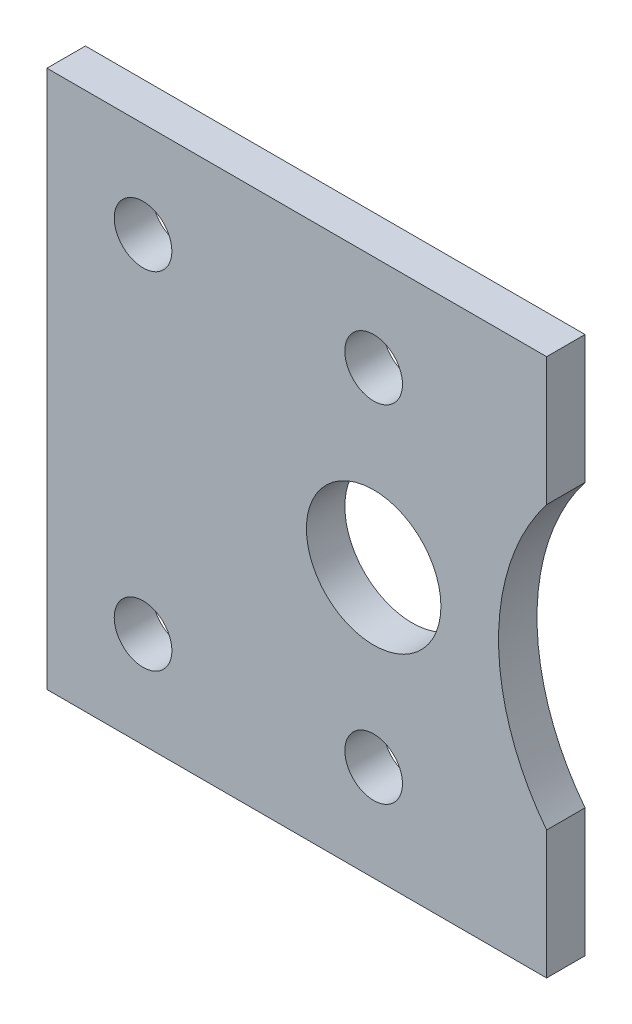
ISO-10303-21;
HEADER;
FILE_DESCRIPTION(('STEP AP214'),'2;1');
FILE_NAME('part.step','',(''),(''),'','','');
FILE_SCHEMA(('AUTOMOTIVE_DESIGN { 1 0 10303 214 1 1 1 1 }'));
ENDSEC;
DATA;
#1=APPLICATION_CONTEXT('core data for automotive mechanical design processes');
#2=APPLICATION_PROTOCOL_DEFINITION('international standard','automotive_design',2000,#1);
#3=PRODUCT_CONTEXT('',#1,'mechanical');
#4=PRODUCT('Part','Part','',(#3));
#5=PRODUCT_RELATED_PRODUCT_CATEGORY('part','',(#4));
#6=PRODUCT_DEFINITION_FORMATION('','',#4);
#7=PRODUCT_DEFINITION_CONTEXT('part definition',#1,'design');
#8=PRODUCT_DEFINITION('design','',#6,#7);
#9=PRODUCT_DEFINITION_SHAPE('','',#8);
#10=(LENGTH_UNIT() NAMED_UNIT(*) SI_UNIT(.MILLI.,.METRE.));
#11=(NAMED_UNIT(*) PLANE_ANGLE_UNIT() SI_UNIT($,.RADIAN.));
#12=(NAMED_UNIT(*) SI_UNIT($,.STERADIAN.) SOLID_ANGLE_UNIT());
#13=UNCERTAINTY_MEASURE_WITH_UNIT(LENGTH_MEASURE(1.E-05),#10,'distance_accuracy_value','');
#14=(GEOMETRIC_REPRESENTATION_CONTEXT(3) GLOBAL_UNCERTAINTY_ASSIGNED_CONTEXT((#13)) GLOBAL_UNIT_ASSIGNED_CONTEXT((#10,
#11,#12)) REPRESENTATION_CONTEXT('',''));
#15=CARTESIAN_POINT('',(0.,0.,0.));
#16=DIRECTION('',(0.,0.,1.));
#17=DIRECTION('',(1.,0.,0.));
#18=AXIS2_PLACEMENT_3D('',#15,#16,#17);
#19=CARTESIAN_POINT('',(-17.,14.,-2.));
#20=DIRECTION('',(-1.,0.,0.));
#21=DIRECTION('',(0.,0.,1.));
#22=AXIS2_PLACEMENT_3D('',#19,#20,#21);
#23=PLANE('',#22);
#24=DIRECTION('',(0.,-1.,0.));
#25=VECTOR('',#24,1.);
#26=CARTESIAN_POINT('',(-17.,14.,0.));
#27=LINE('',#26,#25);
#28=CARTESIAN_POINT('',(-17.,14.,0.));
#29=VERTEX_POINT('',#28);
#30=CARTESIAN_POINT('',(-17.,-14.,0.));
#31=VERTEX_POINT('',#30);
#32=EDGE_CURVE('E125',#29,#31,#27,.T.);
#33=ORIENTED_EDGE('',*,*,#32,.F.);
#34=DIRECTION('',(0.,0.,1.));
#35=VECTOR('',#34,1.);
#36=CARTESIAN_POINT('',(-17.,14.,-2.));
#37=LINE('',#36,#35);
#38=CARTESIAN_POINT('',(-17.,14.,-2.));
#39=VERTEX_POINT('',#38);
#40=EDGE_CURVE('E11',#39,#29,#37,.T.);
#41=ORIENTED_EDGE('',*,*,#40,.F.);
#42=DIRECTION('',(0.,-1.,0.));
#43=VECTOR('',#42,1.);
#44=CARTESIAN_POINT('',(-17.,14.,-2.));
#45=LINE('',#44,#43);
#46=CARTESIAN_POINT('',(-17.,-14.,-2.));
#47=VERTEX_POINT('',#46);
#48=EDGE_CURVE('E137',#39,#47,#45,.T.);
#49=ORIENTED_EDGE('',*,*,#48,.T.);
#50=DIRECTION('',(0.,0.,1.));
#51=VECTOR('',#50,1.);
#52=CARTESIAN_POINT('',(-17.,-14.,-2.));
#53=LINE('',#52,#51);
#54=EDGE_CURVE('E45',#47,#31,#53,.T.);
#55=ORIENTED_EDGE('',*,*,#54,.T.);
#56=EDGE_LOOP('',(#33,#41,#49,#55));
#57=FACE_BOUND('',#56,.T.);
#58=ADVANCED_FACE('F39',(#57),#23,.T.);
#59=CARTESIAN_POINT('',(9.,14.,-2.));
#60=DIRECTION('',(0.,1.,0.));
#61=DIRECTION('',(-1.,0.,0.));
#62=AXIS2_PLACEMENT_3D('',#59,#60,#61);
#63=PLANE('',#62);
#64=DIRECTION('',(-1.,0.,0.));
#65=VECTOR('',#64,1.);
#66=CARTESIAN_POINT('',(9.,14.,0.));
#67=LINE('',#66,#65);
#68=CARTESIAN_POINT('',(9.,14.,0.));
#69=VERTEX_POINT('',#68);
#70=EDGE_CURVE('E140',#69,#29,#67,.T.);
#71=ORIENTED_EDGE('',*,*,#70,.F.);
#72=DIRECTION('',(0.,0.,1.));
#73=VECTOR('',#72,1.);
#74=CARTESIAN_POINT('',(9.,14.,-2.));
#75=LINE('',#74,#73);
#76=CARTESIAN_POINT('',(9.,14.,-2.));
#77=VERTEX_POINT('',#76);
#78=EDGE_CURVE('E48',#77,#69,#75,.T.);
#79=ORIENTED_EDGE('',*,*,#78,.F.);
#80=DIRECTION('',(-1.,0.,0.));
#81=VECTOR('',#80,1.);
#82=CARTESIAN_POINT('',(9.,14.,-2.));
#83=LINE('',#82,#81);
#84=EDGE_CURVE('E114',#77,#39,#83,.T.);
#85=ORIENTED_EDGE('',*,*,#84,.T.);
#86=ORIENTED_EDGE('',*,*,#40,.T.);
#87=EDGE_LOOP('',(#71,#79,#85,#86));
#88=FACE_BOUND('',#87,.T.);
#89=ADVANCED_FACE('F150',(#88),#63,.T.);
#90=CARTESIAN_POINT('',(9.,7.33143914930759,-2.));
#91=DIRECTION('',(1.,0.,0.));
#92=DIRECTION('',(0.,0.,-1.));
#93=AXIS2_PLACEMENT_3D('',#90,#91,#92);
#94=PLANE('',#93);
#95=DIRECTION('',(0.,1.,0.));
#96=VECTOR('',#95,1.);
#97=CARTESIAN_POINT('',(9.,7.33143914930759,0.));
#98=LINE('',#97,#96);
#99=CARTESIAN_POINT('',(9.,7.33143914930759,0.));
#100=VERTEX_POINT('',#99);
#101=EDGE_CURVE('E102',#100,#69,#98,.T.);
#102=ORIENTED_EDGE('',*,*,#101,.F.);
#103=DIRECTION('',(0.,0.,1.));
#104=VECTOR('',#103,1.);
#105=CARTESIAN_POINT('',(9.,7.33143914930759,-2.));
#106=LINE('',#105,#104);
#107=CARTESIAN_POINT('',(9.,7.33143914930759,-2.));
#108=VERTEX_POINT('',#107);
#109=EDGE_CURVE('E96',#108,#100,#106,.T.);
#110=ORIENTED_EDGE('',*,*,#109,.F.);
#111=DIRECTION('',(0.,1.,0.));
#112=VECTOR('',#111,1.);
#113=CARTESIAN_POINT('',(9.,7.33143914930759,-2.));
#114=LINE('',#113,#112);
#115=EDGE_CURVE('E98',#108,#77,#114,.T.);
#116=ORIENTED_EDGE('',*,*,#115,.T.);
#117=ORIENTED_EDGE('',*,*,#78,.T.);
#118=EDGE_LOOP('',(#102,#110,#116,#117));
#119=FACE_BOUND('',#118,.T.);
#120=ADVANCED_FACE('F97',(#119),#94,.T.);
#121=CARTESIAN_POINT('',(18.5,0.,-2.));
#122=DIRECTION('',(0.,0.,1.));
#123=DIRECTION('',(1.,0.,0.));
#124=AXIS2_PLACEMENT_3D('',#121,#122,#123);
#125=CYLINDRICAL_SURFACE('',#124,12.);
#126=CARTESIAN_POINT('',(18.5,0.,0.));
#127=DIRECTION('',(0.,0.,-1.));
#128=DIRECTION('',(-1.,0.,0.));
#129=AXIS2_PLACEMENT_3D('',#126,#127,#128);
#130=CIRCLE('',#129,12.);
#131=CARTESIAN_POINT('',(9.,-7.33143914930759,0.));
#132=VERTEX_POINT('',#131);
#133=EDGE_CURVE('E132',#132,#100,#130,.T.);
#134=ORIENTED_EDGE('',*,*,#133,.F.);
#135=DIRECTION('',(0.,0.,1.));
#136=VECTOR('',#135,1.);
#137=CARTESIAN_POINT('',(9.,-7.33143914930759,-2.));
#138=LINE('',#137,#136);
#139=CARTESIAN_POINT('',(9.,-7.33143914930759,-2.));
#140=VERTEX_POINT('',#139);
#141=EDGE_CURVE('E106',#140,#132,#138,.T.);
#142=ORIENTED_EDGE('',*,*,#141,.F.);
#143=CARTESIAN_POINT('',(18.5,0.,-2.));
#144=DIRECTION('',(0.,0.,-1.));
#145=DIRECTION('',(-1.,0.,0.));
#146=AXIS2_PLACEMENT_3D('',#143,#144,#145);
#147=CIRCLE('',#146,12.);
#148=EDGE_CURVE('E115',#140,#108,#147,.T.);
#149=ORIENTED_EDGE('',*,*,#148,.T.);
#150=ORIENTED_EDGE('',*,*,#109,.T.);
#151=EDGE_LOOP('',(#134,#142,#149,#150));
#152=FACE_BOUND('',#151,.T.);
#153=ADVANCED_FACE('F116',(#152),#125,.F.);
#154=CARTESIAN_POINT('',(9.,-14.,-2.));
#155=DIRECTION('',(1.,0.,0.));
#156=DIRECTION('',(0.,0.,-1.));
#157=AXIS2_PLACEMENT_3D('',#154,#155,#156);
#158=PLANE('',#157);
#159=DIRECTION('',(0.,1.,0.));
#160=VECTOR('',#159,1.);
#161=CARTESIAN_POINT('',(9.,-14.,0.));
#162=LINE('',#161,#160);
#163=CARTESIAN_POINT('',(9.,-14.,0.));
#164=VERTEX_POINT('',#163);
#165=EDGE_CURVE('E131',#164,#132,#162,.T.);
#166=ORIENTED_EDGE('',*,*,#165,.F.);
#167=DIRECTION('',(0.,0.,1.));
#168=VECTOR('',#167,1.);
#169=CARTESIAN_POINT('',(9.,-14.,-2.));
#170=LINE('',#169,#168);
#171=CARTESIAN_POINT('',(9.,-14.,-2.));
#172=VERTEX_POINT('',#171);
#173=EDGE_CURVE('E145',#172,#164,#170,.T.);
#174=ORIENTED_EDGE('',*,*,#173,.F.);
#175=DIRECTION('',(0.,1.,0.));
#176=VECTOR('',#175,1.);
#177=CARTESIAN_POINT('',(9.,-14.,-2.));
#178=LINE('',#177,#176);
#179=EDGE_CURVE('E117',#172,#140,#178,.T.);
#180=ORIENTED_EDGE('',*,*,#179,.T.);
#181=ORIENTED_EDGE('',*,*,#141,.T.);
#182=EDGE_LOOP('',(#166,#174,#180,#181));
#183=FACE_BOUND('',#182,.T.);
#184=ADVANCED_FACE('F158',(#183),#158,.T.);
#185=CARTESIAN_POINT('',(-17.,-14.,-2.));
#186=DIRECTION('',(0.,-1.,0.));
#187=DIRECTION('',(1.,0.,0.));
#188=AXIS2_PLACEMENT_3D('',#185,#186,#187);
#189=PLANE('',#188);
#190=DIRECTION('',(1.,0.,0.));
#191=VECTOR('',#190,1.);
#192=CARTESIAN_POINT('',(-17.,-14.,0.));
#193=LINE('',#192,#191);
#194=EDGE_CURVE('E130',#31,#164,#193,.T.);
#195=ORIENTED_EDGE('',*,*,#194,.F.);
#196=ORIENTED_EDGE('',*,*,#54,.F.);
#197=DIRECTION('',(1.,0.,0.));
#198=VECTOR('',#197,1.);
#199=CARTESIAN_POINT('',(-17.,-14.,-2.));
#200=LINE('',#199,#198);
#201=EDGE_CURVE('E118',#47,#172,#200,.T.);
#202=ORIENTED_EDGE('',*,*,#201,.T.);
#203=ORIENTED_EDGE('',*,*,#173,.T.);
#204=EDGE_LOOP('',(#195,#196,#202,#203));
#205=FACE_BOUND('',#204,.T.);
#206=ADVANCED_FACE('F143',(#205),#189,.T.);
#207=CARTESIAN_POINT('',(18.5,0.,-2.));
#208=DIRECTION('',(0.,0.,-1.));
#209=DIRECTION('',(-1.,0.,0.));
#210=AXIS2_PLACEMENT_3D('',#207,#208,#209);
#211=PLANE('',#210);
#212=CARTESIAN_POINT('',(0.,-9.,-2.));
#213=DIRECTION('',(0.,0.,1.));
#214=DIRECTION('',(-1.,0.,0.));
#215=AXIS2_PLACEMENT_3D('',#212,#213,#214);
#216=CIRCLE('',#215,1.5);
#217=CARTESIAN_POINT('',(-1.5,-9.,-2.));
#218=VERTEX_POINT('',#217);
#219=EDGE_CURVE('E199',#218,#218,#216,.T.);
#220=ORIENTED_EDGE('',*,*,#219,.T.);
#221=EDGE_LOOP('',(#220));
#222=FACE_BOUND('',#221,.T.);
#223=CARTESIAN_POINT('',(-12.,9.,-2.));
#224=DIRECTION('',(0.,0.,1.));
#225=DIRECTION('',(1.,0.,0.));
#226=AXIS2_PLACEMENT_3D('',#223,#224,#225);
#227=CIRCLE('',#226,1.5);
#228=CARTESIAN_POINT('',(-10.5,9.,-2.));
#229=VERTEX_POINT('',#228);
#230=EDGE_CURVE('E206',#229,#229,#227,.T.);
#231=ORIENTED_EDGE('',*,*,#230,.T.);
#232=EDGE_LOOP('',(#231));
#233=FACE_BOUND('',#232,.T.);
#234=CARTESIAN_POINT('',(0.,9.,-2.));
#235=DIRECTION('',(0.,0.,1.));
#236=DIRECTION('',(1.,0.,0.));
#237=AXIS2_PLACEMENT_3D('',#234,#235,#236);
#238=CIRCLE('',#237,1.5);
#239=CARTESIAN_POINT('',(1.5,9.,-2.));
#240=VERTEX_POINT('',#239);
#241=EDGE_CURVE('E212',#240,#240,#238,.T.);
#242=ORIENTED_EDGE('',*,*,#241,.T.);
#243=EDGE_LOOP('',(#242));
#244=FACE_BOUND('',#243,.T.);
#245=CARTESIAN_POINT('',(-12.,-9.,-2.));
#246=DIRECTION('',(0.,0.,1.));
#247=DIRECTION('',(-1.,0.,0.));
#248=AXIS2_PLACEMENT_3D('',#245,#246,#247);
#249=CIRCLE('',#248,1.5);
#250=CARTESIAN_POINT('',(-13.5,-9.,-2.));
#251=VERTEX_POINT('',#250);
#252=EDGE_CURVE('E216',#251,#251,#249,.T.);
#253=ORIENTED_EDGE('',*,*,#252,.T.);
#254=EDGE_LOOP('',(#253));
#255=FACE_BOUND('',#254,.T.);
#256=CARTESIAN_POINT('',(0.,0.,-2.));
#257=DIRECTION('',(0.,0.,1.));
#258=DIRECTION('',(1.,0.,0.));
#259=AXIS2_PLACEMENT_3D('',#256,#257,#258);
#260=CIRCLE('',#259,3.5);
#261=CARTESIAN_POINT('',(3.5,0.,-2.));
#262=VERTEX_POINT('',#261);
#263=EDGE_CURVE('E126',#262,#262,#260,.T.);
#264=ORIENTED_EDGE('',*,*,#263,.T.);
#265=EDGE_LOOP('',(#264));
#266=FACE_BOUND('',#265,.T.);
#267=ORIENTED_EDGE('',*,*,#48,.F.);
#268=ORIENTED_EDGE('',*,*,#84,.F.);
#269=ORIENTED_EDGE('',*,*,#115,.F.);
#270=ORIENTED_EDGE('',*,*,#148,.F.);
#271=ORIENTED_EDGE('',*,*,#179,.F.);
#272=ORIENTED_EDGE('',*,*,#201,.F.);
#273=EDGE_LOOP('',(#267,#268,#269,#270,#271,#272));
#274=FACE_BOUND('',#273,.T.);
#275=ADVANCED_FACE('F110',(#222,#233,#244,#255,#266,#274),#211,.T.);
#276=CARTESIAN_POINT('',(18.5,0.,0.));
#277=DIRECTION('',(0.,0.,-1.));
#278=DIRECTION('',(-1.,0.,0.));
#279=AXIS2_PLACEMENT_3D('',#276,#277,#278);
#280=PLANE('',#279);
#281=CARTESIAN_POINT('',(0.,-9.,0.));
#282=DIRECTION('',(0.,0.,1.));
#283=DIRECTION('',(-1.,0.,0.));
#284=AXIS2_PLACEMENT_3D('',#281,#282,#283);
#285=CIRCLE('',#284,1.5);
#286=CARTESIAN_POINT('',(-1.5,-9.,0.));
#287=VERTEX_POINT('',#286);
#288=EDGE_CURVE('E202',#287,#287,#285,.T.);
#289=ORIENTED_EDGE('',*,*,#288,.F.);
#290=EDGE_LOOP('',(#289));
#291=FACE_BOUND('',#290,.T.);
#292=CARTESIAN_POINT('',(-12.,9.,0.));
#293=DIRECTION('',(0.,0.,1.));
#294=DIRECTION('',(1.,0.,0.));
#295=AXIS2_PLACEMENT_3D('',#292,#293,#294);
#296=CIRCLE('',#295,1.5);
#297=CARTESIAN_POINT('',(-10.5,9.,0.));
#298=VERTEX_POINT('',#297);
#299=EDGE_CURVE('E201',#298,#298,#296,.T.);
#300=ORIENTED_EDGE('',*,*,#299,.F.);
#301=EDGE_LOOP('',(#300));
#302=FACE_BOUND('',#301,.T.);
#303=CARTESIAN_POINT('',(0.,9.,0.));
#304=DIRECTION('',(0.,0.,1.));
#305=DIRECTION('',(1.,0.,0.));
#306=AXIS2_PLACEMENT_3D('',#303,#304,#305);
#307=CIRCLE('',#306,1.5);
#308=CARTESIAN_POINT('',(1.5,9.,0.));
#309=VERTEX_POINT('',#308);
#310=EDGE_CURVE('E208',#309,#309,#307,.T.);
#311=ORIENTED_EDGE('',*,*,#310,.F.);
#312=EDGE_LOOP('',(#311));
#313=FACE_BOUND('',#312,.T.);
#314=CARTESIAN_POINT('',(-12.,-9.,0.));
#315=DIRECTION('',(0.,0.,1.));
#316=DIRECTION('',(-1.,0.,0.));
#317=AXIS2_PLACEMENT_3D('',#314,#315,#316);
#318=CIRCLE('',#317,1.5);
#319=CARTESIAN_POINT('',(-13.5,-9.,0.));
#320=VERTEX_POINT('',#319);
#321=EDGE_CURVE('E214',#320,#320,#318,.T.);
#322=ORIENTED_EDGE('',*,*,#321,.F.);
#323=EDGE_LOOP('',(#322));
#324=FACE_BOUND('',#323,.T.);
#325=CARTESIAN_POINT('',(0.,0.,0.));
#326=DIRECTION('',(0.,0.,1.));
#327=DIRECTION('',(1.,0.,0.));
#328=AXIS2_PLACEMENT_3D('',#325,#326,#327);
#329=CIRCLE('',#328,3.5);
#330=CARTESIAN_POINT('',(3.5,0.,0.));
#331=VERTEX_POINT('',#330);
#332=EDGE_CURVE('E221',#331,#331,#329,.T.);
#333=ORIENTED_EDGE('',*,*,#332,.F.);
#334=EDGE_LOOP('',(#333));
#335=FACE_BOUND('',#334,.T.);
#336=ORIENTED_EDGE('',*,*,#32,.T.);
#337=ORIENTED_EDGE('',*,*,#194,.T.);
#338=ORIENTED_EDGE('',*,*,#165,.T.);
#339=ORIENTED_EDGE('',*,*,#133,.T.);
#340=ORIENTED_EDGE('',*,*,#101,.T.);
#341=ORIENTED_EDGE('',*,*,#70,.T.);
#342=EDGE_LOOP('',(#336,#337,#338,#339,#340,#341));
#343=FACE_BOUND('',#342,.T.);
#344=ADVANCED_FACE('F147',(#291,#302,#313,#324,#335,#343),#280,.F.);
#345=CARTESIAN_POINT('',(0.,0.,-2.));
#346=DIRECTION('',(0.,0.,1.));
#347=DIRECTION('',(1.,0.,0.));
#348=AXIS2_PLACEMENT_3D('',#345,#346,#347);
#349=CYLINDRICAL_SURFACE('',#348,3.5);
#350=ORIENTED_EDGE('',*,*,#263,.F.);
#351=EDGE_LOOP('',(#350));
#352=FACE_BOUND('',#351,.T.);
#353=ORIENTED_EDGE('',*,*,#332,.T.);
#354=EDGE_LOOP('',(#353));
#355=FACE_BOUND('',#354,.T.);
#356=ADVANCED_FACE('F173',(#352,#355),#349,.F.);
#357=CARTESIAN_POINT('',(-12.,-9.,-2.));
#358=DIRECTION('',(0.,0.,1.));
#359=DIRECTION('',(1.,0.,0.));
#360=AXIS2_PLACEMENT_3D('',#357,#358,#359);
#361=CYLINDRICAL_SURFACE('',#360,1.5);
#362=ORIENTED_EDGE('',*,*,#252,.F.);
#363=EDGE_LOOP('',(#362));
#364=FACE_BOUND('',#363,.T.);
#365=ORIENTED_EDGE('',*,*,#321,.T.);
#366=EDGE_LOOP('',(#365));
#367=FACE_BOUND('',#366,.T.);
#368=ADVANCED_FACE('F178',(#364,#367),#361,.F.);
#369=CARTESIAN_POINT('',(0.,9.,-2.));
#370=DIRECTION('',(0.,0.,1.));
#371=DIRECTION('',(1.,0.,0.));
#372=AXIS2_PLACEMENT_3D('',#369,#370,#371);
#373=CYLINDRICAL_SURFACE('',#372,1.5);
#374=ORIENTED_EDGE('',*,*,#241,.F.);
#375=EDGE_LOOP('',(#374));
#376=FACE_BOUND('',#375,.T.);
#377=ORIENTED_EDGE('',*,*,#310,.T.);
#378=EDGE_LOOP('',(#377));
#379=FACE_BOUND('',#378,.T.);
#380=ADVANCED_FACE('F185',(#376,#379),#373,.F.);
#381=CARTESIAN_POINT('',(-12.,9.,-2.));
#382=DIRECTION('',(0.,0.,1.));
#383=DIRECTION('',(1.,0.,0.));
#384=AXIS2_PLACEMENT_3D('',#381,#382,#383);
#385=CYLINDRICAL_SURFACE('',#384,1.5);
#386=ORIENTED_EDGE('',*,*,#230,.F.);
#387=EDGE_LOOP('',(#386));
#388=FACE_BOUND('',#387,.T.);
#389=ORIENTED_EDGE('',*,*,#299,.T.);
#390=EDGE_LOOP('',(#389));
#391=FACE_BOUND('',#390,.T.);
#392=ADVANCED_FACE('F186',(#388,#391),#385,.F.);
#393=CARTESIAN_POINT('',(0.,-9.,-2.));
#394=DIRECTION('',(0.,0.,1.));
#395=DIRECTION('',(1.,0.,0.));
#396=AXIS2_PLACEMENT_3D('',#393,#394,#395);
#397=CYLINDRICAL_SURFACE('',#396,1.5);
#398=ORIENTED_EDGE('',*,*,#219,.F.);
#399=EDGE_LOOP('',(#398));
#400=FACE_BOUND('',#399,.T.);
#401=ORIENTED_EDGE('',*,*,#288,.T.);
#402=EDGE_LOOP('',(#401));
#403=FACE_BOUND('',#402,.T.);
#404=ADVANCED_FACE('F189',(#400,#403),#397,.F.);
#405=CLOSED_SHELL('',(#58,#89,#120,#153,#184,#206,#275,#344,#356,#368,#380,#392,#404));
#406=MANIFOLD_SOLID_BREP('B2',#405);
#407=ADVANCED_BREP_SHAPE_REPRESENTATION('',(#18,#406),#14);
#408=SHAPE_DEFINITION_REPRESENTATION(#9,#407);
ENDSEC;
END-ISO-10303-21;
